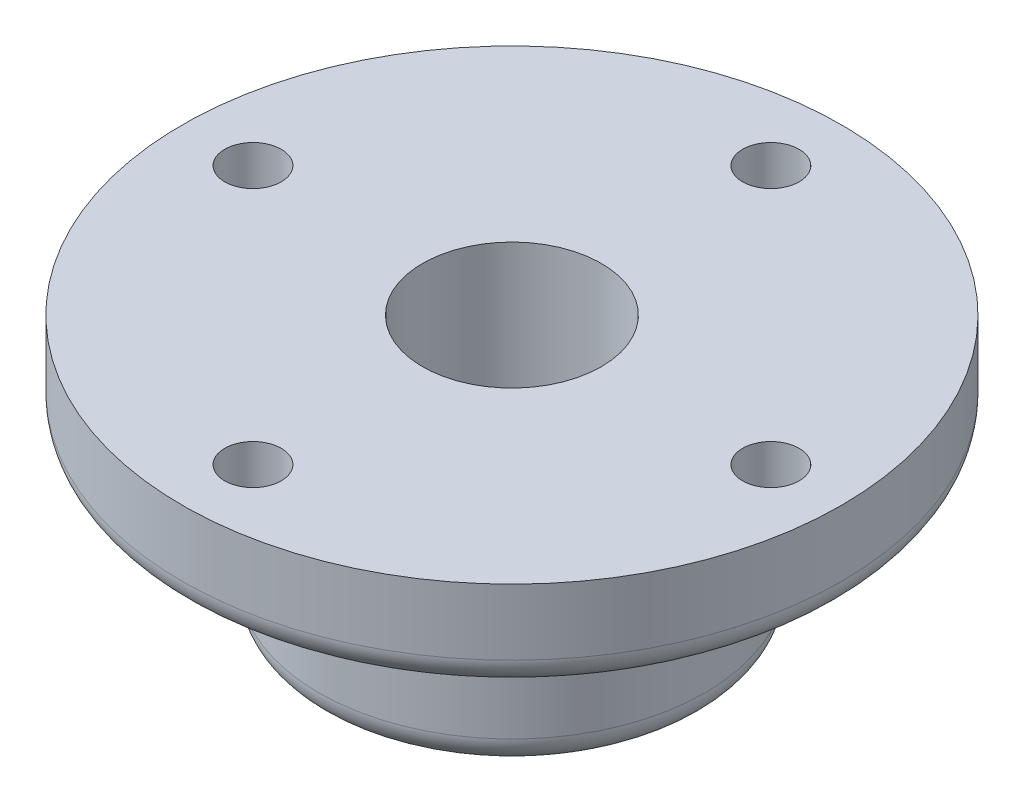
ISO-10303-21;
HEADER;
FILE_DESCRIPTION(('STEP AP214'),'2;1');
FILE_NAME('part.step','',(''),(''),'','','');
FILE_SCHEMA(('AUTOMOTIVE_DESIGN { 1 0 10303 214 1 1 1 1 }'));
ENDSEC;
DATA;
#1=APPLICATION_CONTEXT('core data for automotive mechanical design processes');
#2=APPLICATION_PROTOCOL_DEFINITION('international standard','automotive_design',2000,#1);
#3=PRODUCT_CONTEXT('',#1,'mechanical');
#4=PRODUCT('Part','Part','',(#3));
#5=PRODUCT_RELATED_PRODUCT_CATEGORY('part','',(#4));
#6=PRODUCT_DEFINITION_FORMATION('','',#4);
#7=PRODUCT_DEFINITION_CONTEXT('part definition',#1,'design');
#8=PRODUCT_DEFINITION('design','',#6,#7);
#9=PRODUCT_DEFINITION_SHAPE('','',#8);
#10=(LENGTH_UNIT() NAMED_UNIT(*) SI_UNIT(.MILLI.,.METRE.));
#11=(NAMED_UNIT(*) PLANE_ANGLE_UNIT() SI_UNIT($,.RADIAN.));
#12=(NAMED_UNIT(*) SI_UNIT($,.STERADIAN.) SOLID_ANGLE_UNIT());
#13=UNCERTAINTY_MEASURE_WITH_UNIT(LENGTH_MEASURE(1.E-05),#10,'distance_accuracy_value','');
#14=(GEOMETRIC_REPRESENTATION_CONTEXT(3) GLOBAL_UNCERTAINTY_ASSIGNED_CONTEXT((#13)) GLOBAL_UNIT_ASSIGNED_CONTEXT((#10,
#11,#12)) REPRESENTATION_CONTEXT('',''));
#15=CARTESIAN_POINT('',(0.,0.,0.));
#16=DIRECTION('',(0.,0.,1.));
#17=DIRECTION('',(1.,0.,0.));
#18=AXIS2_PLACEMENT_3D('',#15,#16,#17);
#19=CARTESIAN_POINT('',(0.,13.5,0.));
#20=DIRECTION('',(0.,-1.,0.));
#21=DIRECTION('',(1.,0.,0.));
#22=AXIS2_PLACEMENT_3D('',#19,#20,#21);
#23=TOROIDAL_SURFACE('',#22,64.,6.);
#24=CARTESIAN_POINT('',(0.,13.5,0.));
#25=DIRECTION('',(0.,-1.,0.));
#26=DIRECTION('',(1.,0.,0.));
#27=AXIS2_PLACEMENT_3D('',#24,#25,#26);
#28=CIRCLE('',#27,70.);
#29=CARTESIAN_POINT('',(70.,13.5,0.));
#30=VERTEX_POINT('',#29);
#31=EDGE_CURVE('E82',#30,#30,#28,.T.);
#32=ORIENTED_EDGE('',*,*,#31,.T.);
#33=EDGE_LOOP('',(#32));
#34=FACE_BOUND('',#33,.T.);
#35=CARTESIAN_POINT('',(0.,7.5,0.));
#36=DIRECTION('',(0.,-1.,0.));
#37=DIRECTION('',(1.,0.,0.));
#38=AXIS2_PLACEMENT_3D('',#35,#36,#37);
#39=CIRCLE('',#38,64.);
#40=CARTESIAN_POINT('',(64.,7.5,0.));
#41=VERTEX_POINT('',#40);
#42=EDGE_CURVE('E10',#41,#41,#39,.T.);
#43=ORIENTED_EDGE('',*,*,#42,.F.);
#44=EDGE_LOOP('',(#43));
#45=FACE_BOUND('',#44,.T.);
#46=ADVANCED_FACE('F43',(#34,#45),#23,.T.);
#47=CARTESIAN_POINT('',(64.,7.5,0.));
#48=DIRECTION('',(0.,-1.,0.));
#49=DIRECTION('',(1.,0.,0.));
#50=AXIS2_PLACEMENT_3D('',#47,#48,#49);
#51=PLANE('',#50);
#52=CARTESIAN_POINT('',(-55.,7.49999999999999,0.));
#53=DIRECTION('',(0.,-1.,0.));
#54=DIRECTION('',(1.,0.,0.));
#55=AXIS2_PLACEMENT_3D('',#52,#53,#54);
#56=CIRCLE('',#55,5.99999999999999);
#57=CARTESIAN_POINT('',(-49.,7.49999999999999,0.));
#58=VERTEX_POINT('',#57);
#59=EDGE_CURVE('E111',#58,#58,#56,.T.);
#60=ORIENTED_EDGE('',*,*,#59,.F.);
#61=EDGE_LOOP('',(#60));
#62=FACE_BOUND('',#61,.T.);
#63=CARTESIAN_POINT('',(0.,7.5,55.));
#64=DIRECTION('',(0.,-1.,0.));
#65=DIRECTION('',(1.,0.,0.));
#66=AXIS2_PLACEMENT_3D('',#63,#64,#65);
#67=CIRCLE('',#66,6.);
#68=CARTESIAN_POINT('',(6.,7.5,55.));
#69=VERTEX_POINT('',#68);
#70=EDGE_CURVE('E107',#69,#69,#67,.T.);
#71=ORIENTED_EDGE('',*,*,#70,.F.);
#72=EDGE_LOOP('',(#71));
#73=FACE_BOUND('',#72,.T.);
#74=CARTESIAN_POINT('',(55.,7.5,0.));
#75=DIRECTION('',(0.,-1.,0.));
#76=DIRECTION('',(1.,0.,0.));
#77=AXIS2_PLACEMENT_3D('',#74,#75,#76);
#78=CIRCLE('',#77,5.99999999999999);
#79=CARTESIAN_POINT('',(61.,7.5,0.));
#80=VERTEX_POINT('',#79);
#81=EDGE_CURVE('E99',#80,#80,#78,.T.);
#82=ORIENTED_EDGE('',*,*,#81,.F.);
#83=EDGE_LOOP('',(#82));
#84=FACE_BOUND('',#83,.T.);
#85=CARTESIAN_POINT('',(0.,7.5,-55.));
#86=DIRECTION('',(0.,-1.,0.));
#87=DIRECTION('',(1.,0.,0.));
#88=AXIS2_PLACEMENT_3D('',#85,#86,#87);
#89=CIRCLE('',#88,6.);
#90=CARTESIAN_POINT('',(6.,7.5,-55.));
#91=VERTEX_POINT('',#90);
#92=EDGE_CURVE('E91',#91,#91,#89,.T.);
#93=ORIENTED_EDGE('',*,*,#92,.F.);
#94=EDGE_LOOP('',(#93));
#95=FACE_BOUND('',#94,.T.);
#96=ORIENTED_EDGE('',*,*,#42,.T.);
#97=EDGE_LOOP('',(#96));
#98=FACE_BOUND('',#97,.T.);
#99=CARTESIAN_POINT('',(0.,7.49999999999999,0.));
#100=DIRECTION('',(0.,-1.,0.));
#101=DIRECTION('',(1.,0.,0.));
#102=AXIS2_PLACEMENT_3D('',#99,#100,#101);
#103=CIRCLE('',#102,47.);
#104=CARTESIAN_POINT('',(47.,7.5,0.));
#105=VERTEX_POINT('',#104);
#106=EDGE_CURVE('E50',#105,#105,#103,.T.);
#107=ORIENTED_EDGE('',*,*,#106,.F.);
#108=EDGE_LOOP('',(#107));
#109=FACE_BOUND('',#108,.T.);
#110=ADVANCED_FACE('F129',(#62,#73,#84,#95,#98,#109),#51,.T.);
#111=CARTESIAN_POINT('',(0.,1.49999999999999,0.));
#112=DIRECTION('',(0.,-1.,0.));
#113=DIRECTION('',(1.,0.,0.));
#114=AXIS2_PLACEMENT_3D('',#111,#112,#113);
#115=TOROIDAL_SURFACE('',#114,47.,6.);
#116=ORIENTED_EDGE('',*,*,#106,.T.);
#117=EDGE_LOOP('',(#116));
#118=FACE_BOUND('',#117,.T.);
#119=CARTESIAN_POINT('',(0.,1.49999999999999,0.));
#120=DIRECTION('',(0.,-1.,0.));
#121=DIRECTION('',(1.,0.,0.));
#122=AXIS2_PLACEMENT_3D('',#119,#120,#121);
#123=CIRCLE('',#122,41.);
#124=CARTESIAN_POINT('',(41.,1.5,0.));
#125=VERTEX_POINT('',#124);
#126=EDGE_CURVE('E55',#125,#125,#123,.T.);
#127=ORIENTED_EDGE('',*,*,#126,.F.);
#128=EDGE_LOOP('',(#127));
#129=FACE_BOUND('',#128,.T.);
#130=ADVANCED_FACE('F132',(#118,#129),#115,.F.);
#131=CARTESIAN_POINT('',(0.,-27.5,0.));
#132=DIRECTION('',(0.,-1.,0.));
#133=DIRECTION('',(1.,0.,0.));
#134=AXIS2_PLACEMENT_3D('',#131,#132,#133);
#135=CYLINDRICAL_SURFACE('',#134,41.);
#136=ORIENTED_EDGE('',*,*,#126,.T.);
#137=EDGE_LOOP('',(#136));
#138=FACE_BOUND('',#137,.T.);
#139=CARTESIAN_POINT('',(0.,-21.5,0.));
#140=DIRECTION('',(0.,-1.,0.));
#141=DIRECTION('',(1.,0.,0.));
#142=AXIS2_PLACEMENT_3D('',#139,#140,#141);
#143=CIRCLE('',#142,41.);
#144=CARTESIAN_POINT('',(41.,-21.5,0.));
#145=VERTEX_POINT('',#144);
#146=EDGE_CURVE('E60',#145,#145,#143,.T.);
#147=ORIENTED_EDGE('',*,*,#146,.F.);
#148=EDGE_LOOP('',(#147));
#149=FACE_BOUND('',#148,.T.);
#150=ADVANCED_FACE('F171',(#138,#149),#135,.T.);
#151=CARTESIAN_POINT('',(0.,-21.5,0.));
#152=DIRECTION('',(0.,-1.,0.));
#153=DIRECTION('',(1.,0.,0.));
#154=AXIS2_PLACEMENT_3D('',#151,#152,#153);
#155=TOROIDAL_SURFACE('',#154,35.,6.);
#156=ORIENTED_EDGE('',*,*,#146,.T.);
#157=EDGE_LOOP('',(#156));
#158=FACE_BOUND('',#157,.T.);
#159=CARTESIAN_POINT('',(0.,-27.5,0.));
#160=DIRECTION('',(0.,-1.,0.));
#161=DIRECTION('',(1.,0.,0.));
#162=AXIS2_PLACEMENT_3D('',#159,#160,#161);
#163=CIRCLE('',#162,35.);
#164=CARTESIAN_POINT('',(35.,-27.5,0.));
#165=VERTEX_POINT('',#164);
#166=EDGE_CURVE('E66',#165,#165,#163,.T.);
#167=ORIENTED_EDGE('',*,*,#166,.F.);
#168=EDGE_LOOP('',(#167));
#169=FACE_BOUND('',#168,.T.);
#170=ADVANCED_FACE('F179',(#158,#169),#155,.T.);
#171=CARTESIAN_POINT('',(35.,-27.5,0.));
#172=DIRECTION('',(0.,-1.,0.));
#173=DIRECTION('',(1.,0.,0.));
#174=AXIS2_PLACEMENT_3D('',#171,#172,#173);
#175=PLANE('',#174);
#176=ORIENTED_EDGE('',*,*,#166,.T.);
#177=EDGE_LOOP('',(#176));
#178=FACE_BOUND('',#177,.T.);
#179=CARTESIAN_POINT('',(0.,-27.5,0.));
#180=DIRECTION('',(0.,-1.,0.));
#181=DIRECTION('',(1.,0.,0.));
#182=AXIS2_PLACEMENT_3D('',#179,#180,#181);
#183=CIRCLE('',#182,19.);
#184=CARTESIAN_POINT('',(19.,-27.5,0.));
#185=VERTEX_POINT('',#184);
#186=EDGE_CURVE('E70',#185,#185,#183,.T.);
#187=ORIENTED_EDGE('',*,*,#186,.F.);
#188=EDGE_LOOP('',(#187));
#189=FACE_BOUND('',#188,.T.);
#190=ADVANCED_FACE('F188',(#178,#189),#175,.T.);
#191=CARTESIAN_POINT('',(0.,-27.5,0.));
#192=DIRECTION('',(0.,-1.,0.));
#193=DIRECTION('',(1.,0.,0.));
#194=AXIS2_PLACEMENT_3D('',#191,#192,#193);
#195=CYLINDRICAL_SURFACE('',#194,19.);
#196=ORIENTED_EDGE('',*,*,#186,.T.);
#197=EDGE_LOOP('',(#196));
#198=FACE_BOUND('',#197,.T.);
#199=CARTESIAN_POINT('',(0.,27.5,0.));
#200=DIRECTION('',(0.,-1.,0.));
#201=DIRECTION('',(1.,0.,0.));
#202=AXIS2_PLACEMENT_3D('',#199,#200,#201);
#203=CIRCLE('',#202,19.);
#204=CARTESIAN_POINT('',(19.,27.5,0.));
#205=VERTEX_POINT('',#204);
#206=EDGE_CURVE('E74',#205,#205,#203,.T.);
#207=ORIENTED_EDGE('',*,*,#206,.F.);
#208=EDGE_LOOP('',(#207));
#209=FACE_BOUND('',#208,.T.);
#210=ADVANCED_FACE('F197',(#198,#209),#195,.F.);
#211=CARTESIAN_POINT('',(70.,27.5,0.));
#212=DIRECTION('',(0.,1.,0.));
#213=DIRECTION('',(-1.,0.,0.));
#214=AXIS2_PLACEMENT_3D('',#211,#212,#213);
#215=PLANE('',#214);
#216=CARTESIAN_POINT('',(-55.,27.5,0.));
#217=DIRECTION('',(0.,-1.,0.));
#218=DIRECTION('',(1.,0.,0.));
#219=AXIS2_PLACEMENT_3D('',#216,#217,#218);
#220=CIRCLE('',#219,5.99999999999999);
#221=CARTESIAN_POINT('',(-49.,27.5,0.));
#222=VERTEX_POINT('',#221);
#223=EDGE_CURVE('E86',#222,#222,#220,.T.);
#224=ORIENTED_EDGE('',*,*,#223,.T.);
#225=EDGE_LOOP('',(#224));
#226=FACE_BOUND('',#225,.T.);
#227=CARTESIAN_POINT('',(0.,27.5,55.));
#228=DIRECTION('',(0.,-1.,0.));
#229=DIRECTION('',(1.,0.,0.));
#230=AXIS2_PLACEMENT_3D('',#227,#228,#229);
#231=CIRCLE('',#230,6.);
#232=CARTESIAN_POINT('',(6.,27.5,55.));
#233=VERTEX_POINT('',#232);
#234=EDGE_CURVE('E103',#233,#233,#231,.T.);
#235=ORIENTED_EDGE('',*,*,#234,.T.);
#236=EDGE_LOOP('',(#235));
#237=FACE_BOUND('',#236,.T.);
#238=CARTESIAN_POINT('',(55.,27.5,0.));
#239=DIRECTION('',(0.,-1.,0.));
#240=DIRECTION('',(1.,0.,0.));
#241=AXIS2_PLACEMENT_3D('',#238,#239,#240);
#242=CIRCLE('',#241,5.99999999999999);
#243=CARTESIAN_POINT('',(61.,27.5,0.));
#244=VERTEX_POINT('',#243);
#245=EDGE_CURVE('E95',#244,#244,#242,.T.);
#246=ORIENTED_EDGE('',*,*,#245,.T.);
#247=EDGE_LOOP('',(#246));
#248=FACE_BOUND('',#247,.T.);
#249=CARTESIAN_POINT('',(0.,27.5,-55.));
#250=DIRECTION('',(0.,-1.,0.));
#251=DIRECTION('',(1.,0.,0.));
#252=AXIS2_PLACEMENT_3D('',#249,#250,#251);
#253=CIRCLE('',#252,6.);
#254=CARTESIAN_POINT('',(6.,27.5,-55.));
#255=VERTEX_POINT('',#254);
#256=EDGE_CURVE('E87',#255,#255,#253,.T.);
#257=ORIENTED_EDGE('',*,*,#256,.T.);
#258=EDGE_LOOP('',(#257));
#259=FACE_BOUND('',#258,.T.);
#260=ORIENTED_EDGE('',*,*,#206,.T.);
#261=EDGE_LOOP('',(#260));
#262=FACE_BOUND('',#261,.T.);
#263=CARTESIAN_POINT('',(0.,27.5,0.));
#264=DIRECTION('',(0.,-1.,0.));
#265=DIRECTION('',(1.,0.,0.));
#266=AXIS2_PLACEMENT_3D('',#263,#264,#265);
#267=CIRCLE('',#266,70.);
#268=CARTESIAN_POINT('',(70.,27.5,0.));
#269=VERTEX_POINT('',#268);
#270=EDGE_CURVE('E78',#269,#269,#267,.T.);
#271=ORIENTED_EDGE('',*,*,#270,.F.);
#272=EDGE_LOOP('',(#271));
#273=FACE_BOUND('',#272,.T.);
#274=ADVANCED_FACE('F119',(#226,#237,#248,#259,#262,#273),#215,.T.);
#275=CARTESIAN_POINT('',(0.,-27.5,0.));
#276=DIRECTION('',(0.,-1.,0.));
#277=DIRECTION('',(1.,0.,0.));
#278=AXIS2_PLACEMENT_3D('',#275,#276,#277);
#279=CYLINDRICAL_SURFACE('',#278,70.);
#280=ORIENTED_EDGE('',*,*,#270,.T.);
#281=EDGE_LOOP('',(#280));
#282=FACE_BOUND('',#281,.T.);
#283=ORIENTED_EDGE('',*,*,#31,.F.);
#284=EDGE_LOOP('',(#283));
#285=FACE_BOUND('',#284,.T.);
#286=ADVANCED_FACE('F143',(#282,#285),#279,.T.);
#287=CARTESIAN_POINT('',(0.,27.5,-55.));
#288=DIRECTION('',(0.,-1.,0.));
#289=DIRECTION('',(1.,0.,0.));
#290=AXIS2_PLACEMENT_3D('',#287,#288,#289);
#291=CYLINDRICAL_SURFACE('',#290,6.);
#292=ORIENTED_EDGE('',*,*,#256,.F.);
#293=EDGE_LOOP('',(#292));
#294=FACE_BOUND('',#293,.T.);
#295=ORIENTED_EDGE('',*,*,#92,.T.);
#296=EDGE_LOOP('',(#295));
#297=FACE_BOUND('',#296,.T.);
#298=ADVANCED_FACE('F140',(#294,#297),#291,.F.);
#299=CARTESIAN_POINT('',(55.,27.5,0.));
#300=DIRECTION('',(0.,-1.,0.));
#301=DIRECTION('',(1.,0.,0.));
#302=AXIS2_PLACEMENT_3D('',#299,#300,#301);
#303=CYLINDRICAL_SURFACE('',#302,5.99999999999999);
#304=ORIENTED_EDGE('',*,*,#245,.F.);
#305=EDGE_LOOP('',(#304));
#306=FACE_BOUND('',#305,.T.);
#307=ORIENTED_EDGE('',*,*,#81,.T.);
#308=EDGE_LOOP('',(#307));
#309=FACE_BOUND('',#308,.T.);
#310=ADVANCED_FACE('F142',(#306,#309),#303,.F.);
#311=CARTESIAN_POINT('',(0.,27.5,55.));
#312=DIRECTION('',(0.,-1.,0.));
#313=DIRECTION('',(1.,0.,0.));
#314=AXIS2_PLACEMENT_3D('',#311,#312,#313);
#315=CYLINDRICAL_SURFACE('',#314,6.);
#316=ORIENTED_EDGE('',*,*,#234,.F.);
#317=EDGE_LOOP('',(#316));
#318=FACE_BOUND('',#317,.T.);
#319=ORIENTED_EDGE('',*,*,#70,.T.);
#320=EDGE_LOOP('',(#319));
#321=FACE_BOUND('',#320,.T.);
#322=ADVANCED_FACE('F125',(#318,#321),#315,.F.);
#323=CARTESIAN_POINT('',(-55.,27.5,0.));
#324=DIRECTION('',(0.,-1.,0.));
#325=DIRECTION('',(1.,0.,0.));
#326=AXIS2_PLACEMENT_3D('',#323,#324,#325);
#327=CYLINDRICAL_SURFACE('',#326,5.99999999999999);
#328=ORIENTED_EDGE('',*,*,#223,.F.);
#329=EDGE_LOOP('',(#328));
#330=FACE_BOUND('',#329,.T.);
#331=ORIENTED_EDGE('',*,*,#59,.T.);
#332=EDGE_LOOP('',(#331));
#333=FACE_BOUND('',#332,.T.);
#334=ADVANCED_FACE('F122',(#330,#333),#327,.F.);
#335=CLOSED_SHELL('',(#46,#110,#130,#150,#170,#190,#210,#274,#286,#298,#310,#322,#334));
#336=MANIFOLD_SOLID_BREP('B2',#335);
#337=ADVANCED_BREP_SHAPE_REPRESENTATION('',(#18,#336),#14);
#338=SHAPE_DEFINITION_REPRESENTATION(#9,#337);
ENDSEC;
END-ISO-10303-21;
